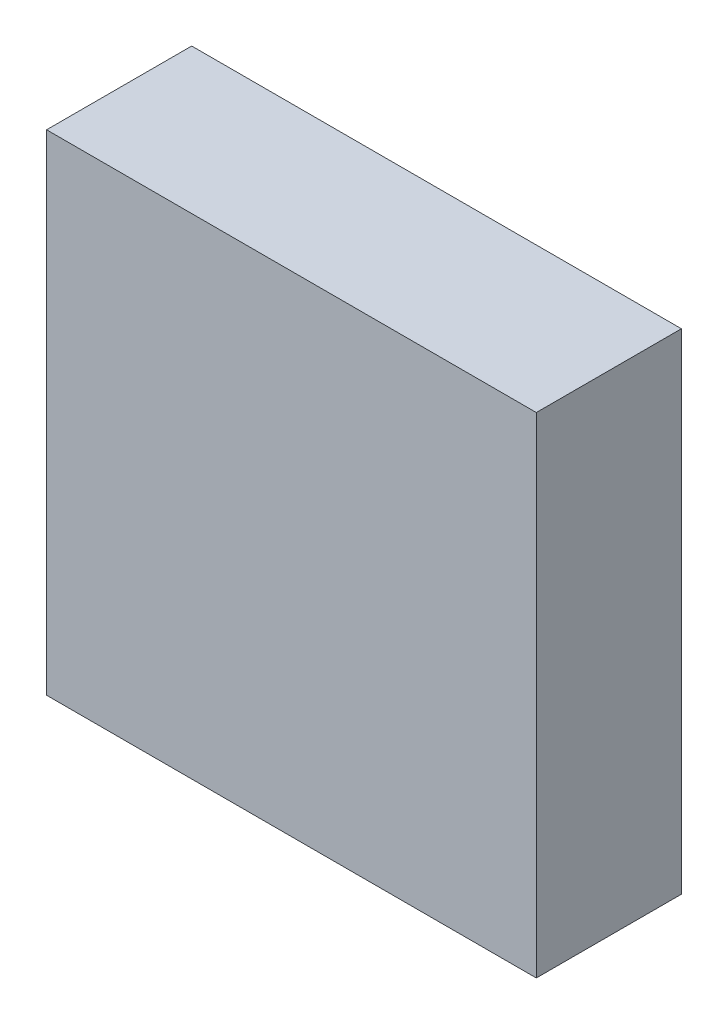
ISO-10303-21;
HEADER;
FILE_DESCRIPTION(('STEP AP214'),'2;1');
FILE_NAME('part.step','',(''),(''),'','','');
FILE_SCHEMA(('AUTOMOTIVE_DESIGN { 1 0 10303 214 1 1 1 1 }'));
ENDSEC;
DATA;
#1=APPLICATION_CONTEXT('core data for automotive mechanical design processes');
#2=APPLICATION_PROTOCOL_DEFINITION('international standard','automotive_design',2000,#1);
#3=PRODUCT_CONTEXT('',#1,'mechanical');
#4=PRODUCT('Part','Part','',(#3));
#5=PRODUCT_RELATED_PRODUCT_CATEGORY('part','',(#4));
#6=PRODUCT_DEFINITION_FORMATION('','',#4);
#7=PRODUCT_DEFINITION_CONTEXT('part definition',#1,'design');
#8=PRODUCT_DEFINITION('design','',#6,#7);
#9=PRODUCT_DEFINITION_SHAPE('','',#8);
#10=(LENGTH_UNIT() NAMED_UNIT(*) SI_UNIT(.MILLI.,.METRE.));
#11=(NAMED_UNIT(*) PLANE_ANGLE_UNIT() SI_UNIT($,.RADIAN.));
#12=(NAMED_UNIT(*) SI_UNIT($,.STERADIAN.) SOLID_ANGLE_UNIT());
#13=UNCERTAINTY_MEASURE_WITH_UNIT(LENGTH_MEASURE(1.E-05),#10,'distance_accuracy_value','');
#14=(GEOMETRIC_REPRESENTATION_CONTEXT(3) GLOBAL_UNCERTAINTY_ASSIGNED_CONTEXT((#13)) GLOBAL_UNIT_ASSIGNED_CONTEXT((#10,
#11,#12)) REPRESENTATION_CONTEXT('',''));
#15=CARTESIAN_POINT('',(0.,0.,0.));
#16=DIRECTION('',(0.,0.,1.));
#17=DIRECTION('',(1.,0.,0.));
#18=AXIS2_PLACEMENT_3D('',#15,#16,#17);
#19=CARTESIAN_POINT('',(85.725,85.725,50.8));
#20=DIRECTION('',(-1.,0.,0.));
#21=DIRECTION('',(0.,-1.,0.));
#22=AXIS2_PLACEMENT_3D('',#19,#20,#21);
#23=PLANE('',#22);
#24=DIRECTION('',(0.,1.,0.));
#25=VECTOR('',#24,1.);
#26=CARTESIAN_POINT('',(85.725,85.725,0.));
#27=LINE('',#26,#25);
#28=CARTESIAN_POINT('',(85.725,-85.725,0.));
#29=VERTEX_POINT('',#28);
#30=CARTESIAN_POINT('',(85.725,85.725,0.));
#31=VERTEX_POINT('',#30);
#32=EDGE_CURVE('E94',#29,#31,#27,.T.);
#33=ORIENTED_EDGE('',*,*,#32,.T.);
#34=DIRECTION('',(0.,0.,-1.));
#35=VECTOR('',#34,1.);
#36=CARTESIAN_POINT('',(85.725,85.725,50.8));
#37=LINE('',#36,#35);
#38=CARTESIAN_POINT('',(85.725,85.725,50.8));
#39=VERTEX_POINT('',#38);
#40=EDGE_CURVE('E11',#39,#31,#37,.T.);
#41=ORIENTED_EDGE('',*,*,#40,.F.);
#42=DIRECTION('',(0.,1.,0.));
#43=VECTOR('',#42,1.);
#44=CARTESIAN_POINT('',(85.725,85.725,50.8));
#45=LINE('',#44,#43);
#46=CARTESIAN_POINT('',(85.725,-85.725,50.8));
#47=VERTEX_POINT('',#46);
#48=EDGE_CURVE('E82',#47,#39,#45,.T.);
#49=ORIENTED_EDGE('',*,*,#48,.F.);
#50=DIRECTION('',(0.,0.,-1.));
#51=VECTOR('',#50,1.);
#52=CARTESIAN_POINT('',(85.725,-85.725,50.8));
#53=LINE('',#52,#51);
#54=EDGE_CURVE('E90',#47,#29,#53,.T.);
#55=ORIENTED_EDGE('',*,*,#54,.T.);
#56=EDGE_LOOP('',(#33,#41,#49,#55));
#57=FACE_BOUND('',#56,.T.);
#58=ADVANCED_FACE('F31',(#57),#23,.F.);
#59=CARTESIAN_POINT('',(-85.725,85.725,50.8));
#60=DIRECTION('',(0.,-1.,0.));
#61=DIRECTION('',(0.,0.,-1.));
#62=AXIS2_PLACEMENT_3D('',#59,#60,#61);
#63=PLANE('',#62);
#64=DIRECTION('',(-1.,0.,0.));
#65=VECTOR('',#64,1.);
#66=CARTESIAN_POINT('',(-85.725,85.725,0.));
#67=LINE('',#66,#65);
#68=CARTESIAN_POINT('',(-85.725,85.725,0.));
#69=VERTEX_POINT('',#68);
#70=EDGE_CURVE('E86',#31,#69,#67,.T.);
#71=ORIENTED_EDGE('',*,*,#70,.T.);
#72=DIRECTION('',(0.,0.,-1.));
#73=VECTOR('',#72,1.);
#74=CARTESIAN_POINT('',(-85.725,85.725,50.8));
#75=LINE('',#74,#73);
#76=CARTESIAN_POINT('',(-85.725,85.725,50.8));
#77=VERTEX_POINT('',#76);
#78=EDGE_CURVE('E39',#77,#69,#75,.T.);
#79=ORIENTED_EDGE('',*,*,#78,.F.);
#80=DIRECTION('',(-1.,0.,0.));
#81=VECTOR('',#80,1.);
#82=CARTESIAN_POINT('',(-85.725,85.725,50.8));
#83=LINE('',#82,#81);
#84=EDGE_CURVE('E77',#39,#77,#83,.T.);
#85=ORIENTED_EDGE('',*,*,#84,.F.);
#86=ORIENTED_EDGE('',*,*,#40,.T.);
#87=EDGE_LOOP('',(#71,#79,#85,#86));
#88=FACE_BOUND('',#87,.T.);
#89=ADVANCED_FACE('F85',(#88),#63,.F.);
#90=CARTESIAN_POINT('',(-85.725,85.725,50.8));
#91=DIRECTION('',(1.,0.,0.));
#92=DIRECTION('',(0.,1.,0.));
#93=AXIS2_PLACEMENT_3D('',#90,#91,#92);
#94=PLANE('',#93);
#95=DIRECTION('',(0.,-1.,0.));
#96=VECTOR('',#95,1.);
#97=CARTESIAN_POINT('',(-85.725,85.725,0.));
#98=LINE('',#97,#96);
#99=CARTESIAN_POINT('',(-85.725,-85.725,0.));
#100=VERTEX_POINT('',#99);
#101=EDGE_CURVE('E64',#69,#100,#98,.T.);
#102=ORIENTED_EDGE('',*,*,#101,.T.);
#103=DIRECTION('',(0.,0.,-1.));
#104=VECTOR('',#103,1.);
#105=CARTESIAN_POINT('',(-85.725,-85.725,50.8));
#106=LINE('',#105,#104);
#107=CARTESIAN_POINT('',(-85.725,-85.725,50.8));
#108=VERTEX_POINT('',#107);
#109=EDGE_CURVE('E87',#108,#100,#106,.T.);
#110=ORIENTED_EDGE('',*,*,#109,.F.);
#111=DIRECTION('',(0.,-1.,0.));
#112=VECTOR('',#111,1.);
#113=CARTESIAN_POINT('',(-85.725,85.725,50.8));
#114=LINE('',#113,#112);
#115=EDGE_CURVE('E80',#77,#108,#114,.T.);
#116=ORIENTED_EDGE('',*,*,#115,.F.);
#117=ORIENTED_EDGE('',*,*,#78,.T.);
#118=EDGE_LOOP('',(#102,#110,#116,#117));
#119=FACE_BOUND('',#118,.T.);
#120=ADVANCED_FACE('F88',(#119),#94,.F.);
#121=CARTESIAN_POINT('',(-85.725,-85.725,50.8));
#122=DIRECTION('',(0.,1.,0.));
#123=DIRECTION('',(-1.,0.,0.));
#124=AXIS2_PLACEMENT_3D('',#121,#122,#123);
#125=PLANE('',#124);
#126=DIRECTION('',(1.,0.,0.));
#127=VECTOR('',#126,1.);
#128=CARTESIAN_POINT('',(-85.725,-85.725,0.));
#129=LINE('',#128,#127);
#130=EDGE_CURVE('E70',#100,#29,#129,.T.);
#131=ORIENTED_EDGE('',*,*,#130,.T.);
#132=ORIENTED_EDGE('',*,*,#54,.F.);
#133=DIRECTION('',(1.,0.,0.));
#134=VECTOR('',#133,1.);
#135=CARTESIAN_POINT('',(-85.725,-85.725,50.8));
#136=LINE('',#135,#134);
#137=EDGE_CURVE('E47',#108,#47,#136,.T.);
#138=ORIENTED_EDGE('',*,*,#137,.F.);
#139=ORIENTED_EDGE('',*,*,#109,.T.);
#140=EDGE_LOOP('',(#131,#132,#138,#139));
#141=FACE_BOUND('',#140,.T.);
#142=ADVANCED_FACE('F101',(#141),#125,.F.);
#143=CARTESIAN_POINT('',(85.725,-85.725,50.8));
#144=DIRECTION('',(0.,0.,1.));
#145=DIRECTION('',(1.,0.,0.));
#146=AXIS2_PLACEMENT_3D('',#143,#144,#145);
#147=PLANE('',#146);
#148=ORIENTED_EDGE('',*,*,#48,.T.);
#149=ORIENTED_EDGE('',*,*,#84,.T.);
#150=ORIENTED_EDGE('',*,*,#115,.T.);
#151=ORIENTED_EDGE('',*,*,#137,.T.);
#152=EDGE_LOOP('',(#148,#149,#150,#151));
#153=FACE_BOUND('',#152,.T.);
#154=ADVANCED_FACE('F78',(#153),#147,.T.);
#155=CARTESIAN_POINT('',(85.725,-85.725,0.));
#156=DIRECTION('',(0.,0.,1.));
#157=DIRECTION('',(1.,0.,0.));
#158=AXIS2_PLACEMENT_3D('',#155,#156,#157);
#159=PLANE('',#158);
#160=ORIENTED_EDGE('',*,*,#32,.F.);
#161=ORIENTED_EDGE('',*,*,#130,.F.);
#162=ORIENTED_EDGE('',*,*,#101,.F.);
#163=ORIENTED_EDGE('',*,*,#70,.F.);
#164=EDGE_LOOP('',(#160,#161,#162,#163));
#165=FACE_BOUND('',#164,.T.);
#166=ADVANCED_FACE('F104',(#165),#159,.F.);
#167=CLOSED_SHELL('',(#58,#89,#120,#142,#154,#166));
#168=MANIFOLD_SOLID_BREP('B2',#167);
#169=ADVANCED_BREP_SHAPE_REPRESENTATION('',(#18,#168),#14);
#170=SHAPE_DEFINITION_REPRESENTATION(#9,#169);
ENDSEC;
END-ISO-10303-21;
